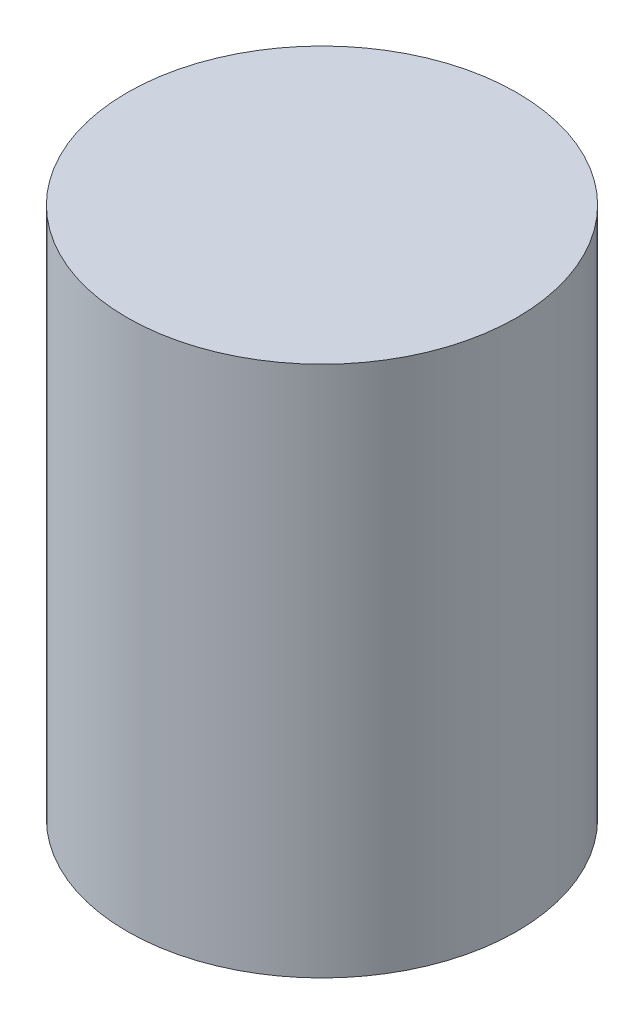
ISO-10303-21;
HEADER;
FILE_DESCRIPTION(('STEP AP214'),'2;1');
FILE_NAME('part.step','',(''),(''),'','','');
FILE_SCHEMA(('AUTOMOTIVE_DESIGN { 1 0 10303 214 1 1 1 1 }'));
ENDSEC;
DATA;
#1=APPLICATION_CONTEXT('core data for automotive mechanical design processes');
#2=APPLICATION_PROTOCOL_DEFINITION('international standard','automotive_design',2000,#1);
#3=PRODUCT_CONTEXT('',#1,'mechanical');
#4=PRODUCT('Part','Part','',(#3));
#5=PRODUCT_RELATED_PRODUCT_CATEGORY('part','',(#4));
#6=PRODUCT_DEFINITION_FORMATION('','',#4);
#7=PRODUCT_DEFINITION_CONTEXT('part definition',#1,'design');
#8=PRODUCT_DEFINITION('design','',#6,#7);
#9=PRODUCT_DEFINITION_SHAPE('','',#8);
#10=(LENGTH_UNIT() NAMED_UNIT(*) SI_UNIT(.MILLI.,.METRE.));
#11=(NAMED_UNIT(*) PLANE_ANGLE_UNIT() SI_UNIT($,.RADIAN.));
#12=(NAMED_UNIT(*) SI_UNIT($,.STERADIAN.) SOLID_ANGLE_UNIT());
#13=UNCERTAINTY_MEASURE_WITH_UNIT(LENGTH_MEASURE(1.E-05),#10,'distance_accuracy_value','');
#14=(GEOMETRIC_REPRESENTATION_CONTEXT(3) GLOBAL_UNCERTAINTY_ASSIGNED_CONTEXT((#13)) GLOBAL_UNIT_ASSIGNED_CONTEXT((#10,
#11,#12)) REPRESENTATION_CONTEXT('',''));
#15=CARTESIAN_POINT('',(0.,0.,0.));
#16=DIRECTION('',(0.,0.,1.));
#17=DIRECTION('',(1.,0.,0.));
#18=AXIS2_PLACEMENT_3D('',#15,#16,#17);
#19=CARTESIAN_POINT('',(0.,0.,-2.75));
#20=DIRECTION('',(0.,-1.,0.));
#21=DIRECTION('',(0.,0.,-1.));
#22=AXIS2_PLACEMENT_3D('',#19,#20,#21);
#23=CYLINDRICAL_SURFACE('',#22,2.75);
#24=CARTESIAN_POINT('',(0.,0.,-2.75));
#25=DIRECTION('',(0.,-1.,0.));
#26=DIRECTION('',(0.,0.,-1.));
#27=AXIS2_PLACEMENT_3D('',#24,#25,#26);
#28=CIRCLE('',#27,2.75);
#29=CARTESIAN_POINT('',(0.,0.,-5.5));
#30=VERTEX_POINT('',#29);
#31=EDGE_CURVE('E10',#30,#30,#28,.T.);
#32=ORIENTED_EDGE('',*,*,#31,.F.);
#33=EDGE_LOOP('',(#32));
#34=FACE_BOUND('',#33,.T.);
#35=CARTESIAN_POINT('',(0.,7.5,-2.75));
#36=DIRECTION('',(0.,-1.,0.));
#37=DIRECTION('',(0.,0.,-1.));
#38=AXIS2_PLACEMENT_3D('',#35,#36,#37);
#39=CIRCLE('',#38,2.75);
#40=CARTESIAN_POINT('',(0.,7.5,-5.5));
#41=VERTEX_POINT('',#40);
#42=EDGE_CURVE('E37',#41,#41,#39,.T.);
#43=ORIENTED_EDGE('',*,*,#42,.T.);
#44=EDGE_LOOP('',(#43));
#45=FACE_BOUND('',#44,.T.);
#46=ADVANCED_FACE('F31',(#34,#45),#23,.T.);
#47=CARTESIAN_POINT('',(0.,0.,0.));
#48=DIRECTION('',(0.,1.,0.));
#49=DIRECTION('',(0.,0.,1.));
#50=AXIS2_PLACEMENT_3D('',#47,#48,#49);
#51=PLANE('',#50);
#52=ORIENTED_EDGE('',*,*,#31,.T.);
#53=EDGE_LOOP('',(#52));
#54=FACE_BOUND('',#53,.T.);
#55=ADVANCED_FACE('F46',(#54),#51,.F.);
#56=CARTESIAN_POINT('',(0.,7.5,-2.75));
#57=DIRECTION('',(0.,-1.,0.));
#58=DIRECTION('',(0.,0.,-1.));
#59=AXIS2_PLACEMENT_3D('',#56,#57,#58);
#60=PLANE('',#59);
#61=ORIENTED_EDGE('',*,*,#42,.F.);
#62=EDGE_LOOP('',(#61));
#63=FACE_BOUND('',#62,.T.);
#64=ADVANCED_FACE('F44',(#63),#60,.F.);
#65=CLOSED_SHELL('',(#46,#55,#64));
#66=MANIFOLD_SOLID_BREP('B2',#65);
#67=ADVANCED_BREP_SHAPE_REPRESENTATION('',(#18,#66),#14);
#68=SHAPE_DEFINITION_REPRESENTATION(#9,#67);
ENDSEC;
END-ISO-10303-21;
